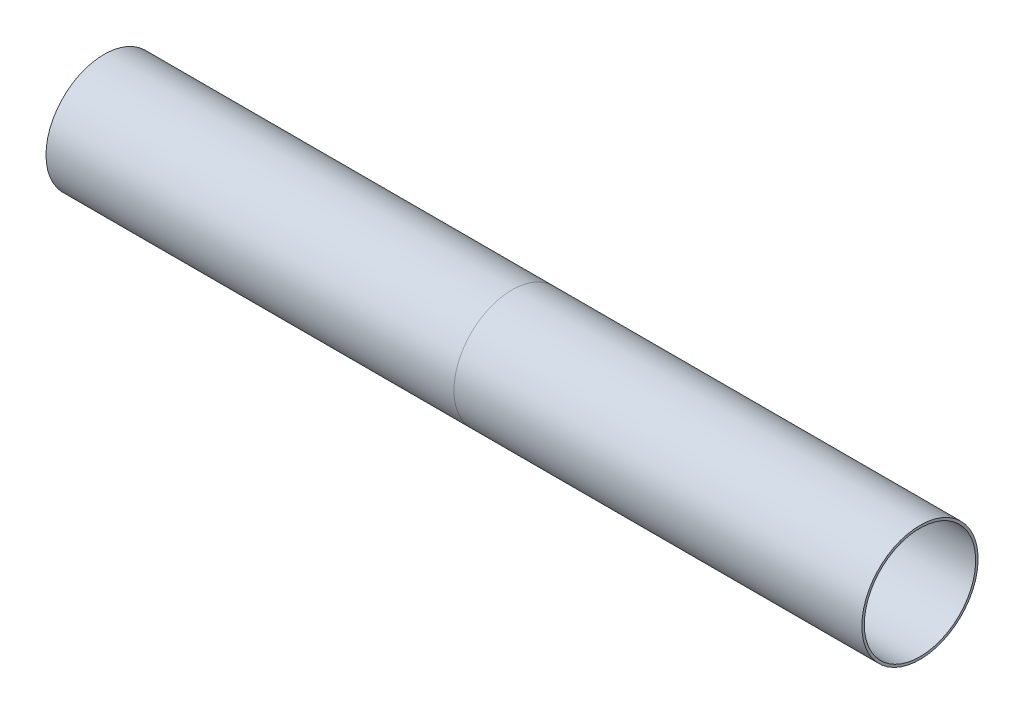
ISO-10303-21;
HEADER;
FILE_DESCRIPTION(('STEP AP214'),'2;1');
FILE_NAME('part.step','',(''),(''),'','','');
FILE_SCHEMA(('AUTOMOTIVE_DESIGN { 1 0 10303 214 1 1 1 1 }'));
ENDSEC;
DATA;
#1=APPLICATION_CONTEXT('core data for automotive mechanical design processes');
#2=APPLICATION_PROTOCOL_DEFINITION('international standard','automotive_design',2000,#1);
#3=PRODUCT_CONTEXT('',#1,'mechanical');
#4=PRODUCT('Part','Part','',(#3));
#5=PRODUCT_RELATED_PRODUCT_CATEGORY('part','',(#4));
#6=PRODUCT_DEFINITION_FORMATION('','',#4);
#7=PRODUCT_DEFINITION_CONTEXT('part definition',#1,'design');
#8=PRODUCT_DEFINITION('design','',#6,#7);
#9=PRODUCT_DEFINITION_SHAPE('','',#8);
#10=(LENGTH_UNIT() NAMED_UNIT(*) SI_UNIT(.MILLI.,.METRE.));
#11=(NAMED_UNIT(*) PLANE_ANGLE_UNIT() SI_UNIT($,.RADIAN.));
#12=(NAMED_UNIT(*) SI_UNIT($,.STERADIAN.) SOLID_ANGLE_UNIT());
#13=UNCERTAINTY_MEASURE_WITH_UNIT(LENGTH_MEASURE(1.E-05),#10,'distance_accuracy_value','');
#14=(GEOMETRIC_REPRESENTATION_CONTEXT(3) GLOBAL_UNCERTAINTY_ASSIGNED_CONTEXT((#13)) GLOBAL_UNIT_ASSIGNED_CONTEXT((#10,
#11,#12)) REPRESENTATION_CONTEXT('',''));
#15=CARTESIAN_POINT('',(0.,0.,0.));
#16=DIRECTION('',(0.,0.,1.));
#17=DIRECTION('',(1.,0.,0.));
#18=AXIS2_PLACEMENT_3D('',#15,#16,#17);
#19=CARTESIAN_POINT('',(-11.4300523027623,0.,-25.1));
#20=DIRECTION('',(1.,0.,0.));
#21=DIRECTION('',(0.,0.,-1.));
#22=AXIS2_PLACEMENT_3D('',#19,#20,#21);
#23=PLANE('',#22);
#24=CARTESIAN_POINT('',(-11.4300523027623,0.,0.));
#25=DIRECTION('',(-1.,0.,0.));
#26=DIRECTION('',(0.,0.,1.));
#27=AXIS2_PLACEMENT_3D('',#24,#25,#26);
#28=CIRCLE('',#27,25.1);
#29=CARTESIAN_POINT('',(-11.4300523027623,0.,25.1));
#30=VERTEX_POINT('',#29);
#31=EDGE_CURVE('E11',#30,#30,#28,.T.);
#32=ORIENTED_EDGE('',*,*,#31,.F.);
#33=EDGE_LOOP('',(#32));
#34=FACE_BOUND('',#33,.T.);
#35=CARTESIAN_POINT('',(-11.4300523027623,0.,0.));
#36=DIRECTION('',(-1.,0.,0.));
#37=DIRECTION('',(0.,0.,1.));
#38=AXIS2_PLACEMENT_3D('',#35,#36,#37);
#39=CIRCLE('',#38,26.3);
#40=CARTESIAN_POINT('',(-11.4300523027623,0.,26.3));
#41=VERTEX_POINT('',#40);
#42=EDGE_CURVE('E86',#41,#41,#39,.T.);
#43=ORIENTED_EDGE('',*,*,#42,.T.);
#44=EDGE_LOOP('',(#43));
#45=FACE_BOUND('',#44,.T.);
#46=ADVANCED_FACE('F60',(#34,#45),#23,.F.);
#47=CARTESIAN_POINT('',(0.,0.,0.));
#48=DIRECTION('',(-1.,0.,0.));
#49=DIRECTION('',(0.,0.,1.));
#50=AXIS2_PLACEMENT_3D('',#47,#48,#49);
#51=CYLINDRICAL_SURFACE('',#50,25.1);
#52=CARTESIAN_POINT('',(11.4300523027623,0.,0.));
#53=DIRECTION('',(-1.,0.,0.));
#54=DIRECTION('',(0.,0.,1.));
#55=AXIS2_PLACEMENT_3D('',#52,#53,#54);
#56=CIRCLE('',#55,25.1);
#57=CARTESIAN_POINT('',(11.4300523027623,0.,25.1));
#58=VERTEX_POINT('',#57);
#59=EDGE_CURVE('E67',#58,#58,#56,.T.);
#60=ORIENTED_EDGE('',*,*,#59,.F.);
#61=EDGE_LOOP('',(#60));
#62=FACE_BOUND('',#61,.T.);
#63=ORIENTED_EDGE('',*,*,#31,.T.);
#64=EDGE_LOOP('',(#63));
#65=FACE_BOUND('',#64,.T.);
#66=ADVANCED_FACE('F106',(#62,#65),#51,.F.);
#67=CARTESIAN_POINT('',(11.4300523027623,0.,-26.3));
#68=DIRECTION('',(-1.,0.,0.));
#69=DIRECTION('',(0.,0.,1.));
#70=AXIS2_PLACEMENT_3D('',#67,#68,#69);
#71=PLANE('',#70);
#72=CARTESIAN_POINT('',(11.4300523027623,0.,0.));
#73=DIRECTION('',(-1.,0.,0.));
#74=DIRECTION('',(0.,0.,1.));
#75=AXIS2_PLACEMENT_3D('',#72,#73,#74);
#76=CIRCLE('',#75,26.3);
#77=CARTESIAN_POINT('',(11.4300523027623,0.,26.3));
#78=VERTEX_POINT('',#77);
#79=EDGE_CURVE('E73',#78,#78,#76,.T.);
#80=ORIENTED_EDGE('',*,*,#79,.F.);
#81=EDGE_LOOP('',(#80));
#82=FACE_BOUND('',#81,.T.);
#83=ORIENTED_EDGE('',*,*,#59,.T.);
#84=EDGE_LOOP('',(#83));
#85=FACE_BOUND('',#84,.T.);
#86=ADVANCED_FACE('F101',(#82,#85),#71,.F.);
#87=CARTESIAN_POINT('',(11.4300523027623,0.,0.));
#88=DIRECTION('',(-1.,0.,0.));
#89=DIRECTION('',(0.,0.,1.));
#90=AXIS2_PLACEMENT_3D('',#87,#88,#89);
#91=CONICAL_SURFACE('',#90,26.3,0.0872664625997095);
#92=CARTESIAN_POINT('',(0.,0.,0.));
#93=DIRECTION('',(-1.,0.,0.));
#94=DIRECTION('',(0.,0.,1.));
#95=AXIS2_PLACEMENT_3D('',#92,#93,#94);
#96=CIRCLE('',#95,27.3);
#97=CARTESIAN_POINT('',(0.,0.,27.3));
#98=VERTEX_POINT('',#97);
#99=EDGE_CURVE('E80',#98,#98,#96,.T.);
#100=ORIENTED_EDGE('',*,*,#99,.F.);
#101=EDGE_LOOP('',(#100));
#102=FACE_BOUND('',#101,.T.);
#103=ORIENTED_EDGE('',*,*,#79,.T.);
#104=EDGE_LOOP('',(#103));
#105=FACE_BOUND('',#104,.T.);
#106=ADVANCED_FACE('F95',(#102,#105),#91,.T.);
#107=CARTESIAN_POINT('',(0.,0.,0.));
#108=DIRECTION('',(1.,0.,0.));
#109=DIRECTION('',(0.,0.,-1.));
#110=AXIS2_PLACEMENT_3D('',#107,#108,#109);
#111=CONICAL_SURFACE('',#110,27.3,0.0872664625997095);
#112=ORIENTED_EDGE('',*,*,#42,.F.);
#113=EDGE_LOOP('',(#112));
#114=FACE_BOUND('',#113,.T.);
#115=ORIENTED_EDGE('',*,*,#99,.T.);
#116=EDGE_LOOP('',(#115));
#117=FACE_BOUND('',#116,.T.);
#118=ADVANCED_FACE('F92',(#114,#117),#111,.T.);
#119=CLOSED_SHELL('',(#46,#66,#86,#106,#118));
#120=MANIFOLD_SOLID_BREP('B2_NOT_SHOWN',#119);
#121=CARTESIAN_POINT('',(0.,0.,0.));
#122=DIRECTION('',(-1.,0.,0.));
#123=DIRECTION('',(0.,0.,1.));
#124=AXIS2_PLACEMENT_3D('',#121,#122,#123);
#125=CYLINDRICAL_SURFACE('',#124,27.3);
#126=CARTESIAN_POINT('',(-12.4300523027623,0.,0.));
#127=DIRECTION('',(-1.,0.,0.));
#128=DIRECTION('',(0.,0.,1.));
#129=AXIS2_PLACEMENT_3D('',#126,#127,#128);
#130=CIRCLE('',#129,27.3);
#131=CARTESIAN_POINT('',(-12.4300523027623,0.,27.3));
#132=VERTEX_POINT('',#131);
#133=EDGE_CURVE('E200',#132,#132,#130,.T.);
#134=ORIENTED_EDGE('',*,*,#133,.F.);
#135=EDGE_LOOP('',(#134));
#136=FACE_BOUND('',#135,.T.);
#137=CARTESIAN_POINT('',(-187.569947697238,0.,0.));
#138=DIRECTION('',(1.,0.,0.));
#139=DIRECTION('',(0.,0.,-1.));
#140=AXIS2_PLACEMENT_3D('',#137,#138,#139);
#141=CIRCLE('',#140,27.3);
#142=CARTESIAN_POINT('',(-187.569947697238,0.,-27.3));
#143=VERTEX_POINT('',#142);
#144=EDGE_CURVE('E59',#143,#143,#141,.T.);
#145=ORIENTED_EDGE('',*,*,#144,.F.);
#146=EDGE_LOOP('',(#145));
#147=FACE_BOUND('',#146,.T.);
#148=ADVANCED_FACE('F179',(#136,#147),#125,.F.);
#149=CARTESIAN_POINT('',(0.,0.,0.));
#150=DIRECTION('',(-1.,0.,0.));
#151=DIRECTION('',(0.,0.,1.));
#152=AXIS2_PLACEMENT_3D('',#149,#150,#151);
#153=CYLINDRICAL_SURFACE('',#152,28.5);
#154=CARTESIAN_POINT('',(0.,0.,0.));
#155=DIRECTION('',(-1.,0.,0.));
#156=DIRECTION('',(0.,0.,1.));
#157=AXIS2_PLACEMENT_3D('',#154,#155,#156);
#158=CIRCLE('',#157,28.5);
#159=CARTESIAN_POINT('',(0.,0.,28.5));
#160=VERTEX_POINT('',#159);
#161=EDGE_CURVE('E212',#160,#160,#158,.T.);
#162=ORIENTED_EDGE('',*,*,#161,.T.);
#163=EDGE_LOOP('',(#162));
#164=FACE_BOUND('',#163,.T.);
#165=CARTESIAN_POINT('',(-200.,0.,0.));
#166=DIRECTION('',(-1.,0.,0.));
#167=DIRECTION('',(0.,0.,1.));
#168=AXIS2_PLACEMENT_3D('',#165,#166,#167);
#169=CIRCLE('',#168,28.5);
#170=CARTESIAN_POINT('',(-200.,0.,28.5));
#171=VERTEX_POINT('',#170);
#172=EDGE_CURVE('E188',#171,#171,#169,.T.);
#173=ORIENTED_EDGE('',*,*,#172,.F.);
#174=EDGE_LOOP('',(#173));
#175=FACE_BOUND('',#174,.T.);
#176=ADVANCED_FACE('F230',(#164,#175),#153,.T.);
#177=CARTESIAN_POINT('',(-200.,0.,0.));
#178=DIRECTION('',(1.,0.,0.));
#179=DIRECTION('',(0.,0.,-1.));
#180=AXIS2_PLACEMENT_3D('',#177,#178,#179);
#181=PLANE('',#180);
#182=CARTESIAN_POINT('',(-200.,0.,0.));
#183=DIRECTION('',(-1.,0.,0.));
#184=DIRECTION('',(0.,0.,1.));
#185=AXIS2_PLACEMENT_3D('',#182,#183,#184);
#186=CIRCLE('',#185,27.3);
#187=CARTESIAN_POINT('',(-200.,0.,27.3));
#188=VERTEX_POINT('',#187);
#189=EDGE_CURVE('E195',#188,#188,#186,.T.);
#190=ORIENTED_EDGE('',*,*,#189,.F.);
#191=EDGE_LOOP('',(#190));
#192=FACE_BOUND('',#191,.T.);
#193=ORIENTED_EDGE('',*,*,#172,.T.);
#194=EDGE_LOOP('',(#193));
#195=FACE_BOUND('',#194,.T.);
#196=ADVANCED_FACE('F226',(#192,#195),#181,.F.);
#197=CARTESIAN_POINT('',(-11.4300523027623,0.,0.));
#198=DIRECTION('',(-1.,0.,0.));
#199=DIRECTION('',(0.,0.,1.));
#200=AXIS2_PLACEMENT_3D('',#197,#198,#199);
#201=CONICAL_SURFACE('',#200,26.3,0.785398163397448);
#202=ORIENTED_EDGE('',*,*,#133,.T.);
#203=EDGE_LOOP('',(#202));
#204=FACE_BOUND('',#203,.T.);
#205=CARTESIAN_POINT('',(-11.4300523027623,0.,0.));
#206=DIRECTION('',(-1.,0.,0.));
#207=DIRECTION('',(0.,0.,1.));
#208=AXIS2_PLACEMENT_3D('',#205,#206,#207);
#209=CIRCLE('',#208,26.3);
#210=CARTESIAN_POINT('',(-11.4300523027623,0.,26.3));
#211=VERTEX_POINT('',#210);
#212=EDGE_CURVE('E204',#211,#211,#209,.T.);
#213=ORIENTED_EDGE('',*,*,#212,.F.);
#214=EDGE_LOOP('',(#213));
#215=FACE_BOUND('',#214,.T.);
#216=ADVANCED_FACE('F229',(#204,#215),#201,.F.);
#217=CARTESIAN_POINT('',(0.,0.,0.));
#218=DIRECTION('',(1.,0.,0.));
#219=DIRECTION('',(0.,0.,-1.));
#220=AXIS2_PLACEMENT_3D('',#217,#218,#219);
#221=CONICAL_SURFACE('',#220,27.3,0.0872664625997098);
#222=ORIENTED_EDGE('',*,*,#212,.T.);
#223=EDGE_LOOP('',(#222));
#224=FACE_BOUND('',#223,.T.);
#225=CARTESIAN_POINT('',(0.,0.,0.));
#226=DIRECTION('',(-1.,0.,0.));
#227=DIRECTION('',(0.,0.,1.));
#228=AXIS2_PLACEMENT_3D('',#225,#226,#227);
#229=CIRCLE('',#228,27.3);
#230=CARTESIAN_POINT('',(0.,0.,27.3));
#231=VERTEX_POINT('',#230);
#232=EDGE_CURVE('E208',#231,#231,#229,.T.);
#233=ORIENTED_EDGE('',*,*,#232,.F.);
#234=EDGE_LOOP('',(#233));
#235=FACE_BOUND('',#234,.T.);
#236=ADVANCED_FACE('F246',(#224,#235),#221,.F.);
#237=CARTESIAN_POINT('',(0.,0.,0.));
#238=DIRECTION('',(1.,0.,0.));
#239=DIRECTION('',(0.,0.,-1.));
#240=AXIS2_PLACEMENT_3D('',#237,#238,#239);
#241=PLANE('',#240);
#242=ORIENTED_EDGE('',*,*,#232,.T.);
#243=EDGE_LOOP('',(#242));
#244=FACE_BOUND('',#243,.T.);
#245=ORIENTED_EDGE('',*,*,#161,.F.);
#246=EDGE_LOOP('',(#245));
#247=FACE_BOUND('',#246,.T.);
#248=ADVANCED_FACE('F242',(#244,#247),#241,.T.);
#249=CARTESIAN_POINT('',(-188.569947697238,0.,0.));
#250=DIRECTION('',(1.,0.,0.));
#251=DIRECTION('',(0.,0.,-1.));
#252=AXIS2_PLACEMENT_3D('',#249,#250,#251);
#253=CONICAL_SURFACE('',#252,26.3,0.785398163397462);
#254=ORIENTED_EDGE('',*,*,#144,.T.);
#255=EDGE_LOOP('',(#254));
#256=FACE_BOUND('',#255,.T.);
#257=CARTESIAN_POINT('',(-188.569947697238,0.,0.));
#258=DIRECTION('',(-1.,0.,0.));
#259=DIRECTION('',(0.,0.,1.));
#260=AXIS2_PLACEMENT_3D('',#257,#258,#259);
#261=CIRCLE('',#260,26.3);
#262=CARTESIAN_POINT('',(-188.569947697238,0.,26.3));
#263=VERTEX_POINT('',#262);
#264=EDGE_CURVE('E183',#263,#263,#261,.T.);
#265=ORIENTED_EDGE('',*,*,#264,.T.);
#266=EDGE_LOOP('',(#265));
#267=FACE_BOUND('',#266,.T.);
#268=ADVANCED_FACE('F181',(#256,#267),#253,.F.);
#269=CARTESIAN_POINT('',(-200.,0.,0.));
#270=DIRECTION('',(-1.,0.,0.));
#271=DIRECTION('',(0.,0.,1.));
#272=AXIS2_PLACEMENT_3D('',#269,#270,#271);
#273=CONICAL_SURFACE('',#272,27.3,0.08726646259971);
#274=ORIENTED_EDGE('',*,*,#264,.F.);
#275=EDGE_LOOP('',(#274));
#276=FACE_BOUND('',#275,.T.);
#277=ORIENTED_EDGE('',*,*,#189,.T.);
#278=EDGE_LOOP('',(#277));
#279=FACE_BOUND('',#278,.T.);
#280=ADVANCED_FACE('F221',(#276,#279),#273,.F.);
#281=CLOSED_SHELL('',(#148,#176,#196,#216,#236,#248,#268,#280));
#282=MANIFOLD_SOLID_BREP('B6_NOT_SHOWN',#281);
#283=CARTESIAN_POINT('',(0.,0.,0.));
#284=DIRECTION('',(-1.,0.,0.));
#285=DIRECTION('',(0.,0.,1.));
#286=AXIS2_PLACEMENT_3D('',#283,#284,#285);
#287=CONICAL_SURFACE('',#286,27.3,0.0872664625997098);
#288=CARTESIAN_POINT('',(11.4300523027623,0.,0.));
#289=DIRECTION('',(-1.,0.,0.));
#290=DIRECTION('',(0.,0.,1.));
#291=AXIS2_PLACEMENT_3D('',#288,#289,#290);
#292=CIRCLE('',#291,26.3);
#293=CARTESIAN_POINT('',(11.4300523027623,0.,26.3));
#294=VERTEX_POINT('',#293);
#295=EDGE_CURVE('E178',#294,#294,#292,.T.);
#296=ORIENTED_EDGE('',*,*,#295,.F.);
#297=EDGE_LOOP('',(#296));
#298=FACE_BOUND('',#297,.T.);
#299=CARTESIAN_POINT('',(0.,0.,0.));
#300=DIRECTION('',(-1.,0.,0.));
#301=DIRECTION('',(0.,0.,1.));
#302=AXIS2_PLACEMENT_3D('',#299,#300,#301);
#303=CIRCLE('',#302,27.3);
#304=CARTESIAN_POINT('',(0.,0.,27.3));
#305=VERTEX_POINT('',#304);
#306=EDGE_CURVE('E383',#305,#305,#303,.T.);
#307=ORIENTED_EDGE('',*,*,#306,.T.);
#308=EDGE_LOOP('',(#307));
#309=FACE_BOUND('',#308,.T.);
#310=ADVANCED_FACE('F355',(#298,#309),#287,.F.);
#311=CARTESIAN_POINT('',(11.4300523027623,0.,0.));
#312=DIRECTION('',(1.,0.,0.));
#313=DIRECTION('',(0.,0.,-1.));
#314=AXIS2_PLACEMENT_3D('',#311,#312,#313);
#315=CONICAL_SURFACE('',#314,26.3,0.78539816339745);
#316=CARTESIAN_POINT('',(12.4300523027623,0.,0.));
#317=DIRECTION('',(-1.,0.,0.));
#318=DIRECTION('',(0.,0.,1.));
#319=AXIS2_PLACEMENT_3D('',#316,#317,#318);
#320=CIRCLE('',#319,27.3);
#321=CARTESIAN_POINT('',(12.4300523027623,0.,27.3));
#322=VERTEX_POINT('',#321);
#323=EDGE_CURVE('E362',#322,#322,#320,.T.);
#324=ORIENTED_EDGE('',*,*,#323,.F.);
#325=EDGE_LOOP('',(#324));
#326=FACE_BOUND('',#325,.T.);
#327=ORIENTED_EDGE('',*,*,#295,.T.);
#328=EDGE_LOOP('',(#327));
#329=FACE_BOUND('',#328,.T.);
#330=ADVANCED_FACE('F408',(#326,#329),#315,.F.);
#331=CARTESIAN_POINT('',(0.,0.,0.));
#332=DIRECTION('',(-1.,0.,0.));
#333=DIRECTION('',(0.,0.,1.));
#334=AXIS2_PLACEMENT_3D('',#331,#332,#333);
#335=CYLINDRICAL_SURFACE('',#334,27.3);
#336=ORIENTED_EDGE('',*,*,#323,.T.);
#337=EDGE_LOOP('',(#336));
#338=FACE_BOUND('',#337,.T.);
#339=CARTESIAN_POINT('',(200.,0.,0.));
#340=DIRECTION('',(-1.,0.,0.));
#341=DIRECTION('',(0.,0.,1.));
#342=AXIS2_PLACEMENT_3D('',#339,#340,#341);
#343=CIRCLE('',#342,27.3);
#344=CARTESIAN_POINT('',(200.,0.,27.3));
#345=VERTEX_POINT('',#344);
#346=EDGE_CURVE('E368',#345,#345,#343,.T.);
#347=ORIENTED_EDGE('',*,*,#346,.F.);
#348=EDGE_LOOP('',(#347));
#349=FACE_BOUND('',#348,.T.);
#350=ADVANCED_FACE('F402',(#338,#349),#335,.F.);
#351=CARTESIAN_POINT('',(200.,0.,0.));
#352=DIRECTION('',(1.,0.,0.));
#353=DIRECTION('',(0.,0.,-1.));
#354=AXIS2_PLACEMENT_3D('',#351,#352,#353);
#355=PLANE('',#354);
#356=ORIENTED_EDGE('',*,*,#346,.T.);
#357=EDGE_LOOP('',(#356));
#358=FACE_BOUND('',#357,.T.);
#359=CARTESIAN_POINT('',(200.,0.,0.));
#360=DIRECTION('',(-1.,0.,0.));
#361=DIRECTION('',(0.,0.,1.));
#362=AXIS2_PLACEMENT_3D('',#359,#360,#361);
#363=CIRCLE('',#362,28.5);
#364=CARTESIAN_POINT('',(200.,0.,28.5));
#365=VERTEX_POINT('',#364);
#366=EDGE_CURVE('E375',#365,#365,#363,.T.);
#367=ORIENTED_EDGE('',*,*,#366,.F.);
#368=EDGE_LOOP('',(#367));
#369=FACE_BOUND('',#368,.T.);
#370=ADVANCED_FACE('F397',(#358,#369),#355,.T.);
#371=CARTESIAN_POINT('',(0.,0.,0.));
#372=DIRECTION('',(-1.,0.,0.));
#373=DIRECTION('',(0.,0.,1.));
#374=AXIS2_PLACEMENT_3D('',#371,#372,#373);
#375=CYLINDRICAL_SURFACE('',#374,28.5);
#376=CARTESIAN_POINT('',(0.,0.,0.));
#377=DIRECTION('',(-1.,0.,0.));
#378=DIRECTION('',(0.,0.,1.));
#379=AXIS2_PLACEMENT_3D('',#376,#377,#378);
#380=CIRCLE('',#379,28.5);
#381=CARTESIAN_POINT('',(0.,0.,28.5));
#382=VERTEX_POINT('',#381);
#383=EDGE_CURVE('E380',#382,#382,#380,.T.);
#384=ORIENTED_EDGE('',*,*,#383,.F.);
#385=EDGE_LOOP('',(#384));
#386=FACE_BOUND('',#385,.T.);
#387=ORIENTED_EDGE('',*,*,#366,.T.);
#388=EDGE_LOOP('',(#387));
#389=FACE_BOUND('',#388,.T.);
#390=ADVANCED_FACE('F391',(#386,#389),#375,.T.);
#391=CARTESIAN_POINT('',(0.,0.,0.));
#392=DIRECTION('',(1.,0.,0.));
#393=DIRECTION('',(0.,0.,-1.));
#394=AXIS2_PLACEMENT_3D('',#391,#392,#393);
#395=PLANE('',#394);
#396=ORIENTED_EDGE('',*,*,#306,.F.);
#397=EDGE_LOOP('',(#396));
#398=FACE_BOUND('',#397,.T.);
#399=ORIENTED_EDGE('',*,*,#383,.T.);
#400=EDGE_LOOP('',(#399));
#401=FACE_BOUND('',#400,.T.);
#402=ADVANCED_FACE('F388',(#398,#401),#395,.F.);
#403=CLOSED_SHELL('',(#310,#330,#350,#370,#390,#402));
#404=MANIFOLD_SOLID_BREP('B54',#403);
#405=ADVANCED_BREP_SHAPE_REPRESENTATION('',(#18,#120,#282,#404),#14);
#406=SHAPE_DEFINITION_REPRESENTATION(#9,#405);
ENDSEC;
END-ISO-10303-21;
